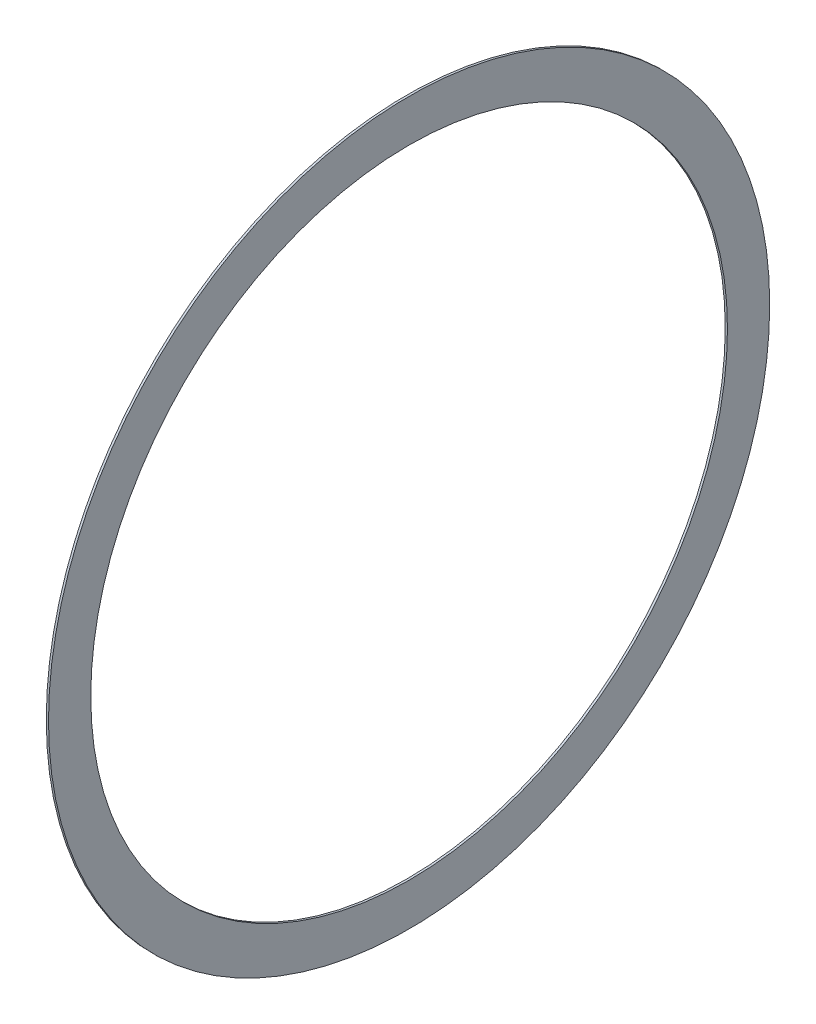
ISO-10303-21;
HEADER;
FILE_DESCRIPTION(('STEP AP214'),'2;1');
FILE_NAME('part.step','',(''),(''),'','','');
FILE_SCHEMA(('AUTOMOTIVE_DESIGN { 1 0 10303 214 1 1 1 1 }'));
ENDSEC;
DATA;
#1=APPLICATION_CONTEXT('core data for automotive mechanical design processes');
#2=APPLICATION_PROTOCOL_DEFINITION('international standard','automotive_design',2000,#1);
#3=PRODUCT_CONTEXT('',#1,'mechanical');
#4=PRODUCT('Part','Part','',(#3));
#5=PRODUCT_RELATED_PRODUCT_CATEGORY('part','',(#4));
#6=PRODUCT_DEFINITION_FORMATION('','',#4);
#7=PRODUCT_DEFINITION_CONTEXT('part definition',#1,'design');
#8=PRODUCT_DEFINITION('design','',#6,#7);
#9=PRODUCT_DEFINITION_SHAPE('','',#8);
#10=(LENGTH_UNIT() NAMED_UNIT(*) SI_UNIT(.MILLI.,.METRE.));
#11=(NAMED_UNIT(*) PLANE_ANGLE_UNIT() SI_UNIT($,.RADIAN.));
#12=(NAMED_UNIT(*) SI_UNIT($,.STERADIAN.) SOLID_ANGLE_UNIT());
#13=UNCERTAINTY_MEASURE_WITH_UNIT(LENGTH_MEASURE(1.E-05),#10,'distance_accuracy_value','');
#14=(GEOMETRIC_REPRESENTATION_CONTEXT(3) GLOBAL_UNCERTAINTY_ASSIGNED_CONTEXT((#13)) GLOBAL_UNIT_ASSIGNED_CONTEXT((#10,
#11,#12)) REPRESENTATION_CONTEXT('',''));
#15=CARTESIAN_POINT('',(0.,0.,0.));
#16=DIRECTION('',(0.,0.,1.));
#17=DIRECTION('',(1.,0.,0.));
#18=AXIS2_PLACEMENT_3D('',#15,#16,#17);
#19=CARTESIAN_POINT('',(0.15,21.65,0.));
#20=DIRECTION('',(1.,0.,0.));
#21=DIRECTION('',(0.,1.,0.));
#22=AXIS2_PLACEMENT_3D('',#19,#20,#21);
#23=PLANE('',#22);
#24=CARTESIAN_POINT('',(0.15,0.,0.));
#25=DIRECTION('',(1.,0.,0.));
#26=DIRECTION('',(0.,0.,-1.));
#27=AXIS2_PLACEMENT_3D('',#24,#25,#26);
#28=CIRCLE('',#27,21.65);
#29=CARTESIAN_POINT('',(0.15,0.,-21.65));
#30=VERTEX_POINT('',#29);
#31=EDGE_CURVE('E10',#30,#30,#28,.T.);
#32=ORIENTED_EDGE('',*,*,#31,.F.);
#33=EDGE_LOOP('',(#32));
#34=FACE_BOUND('',#33,.T.);
#35=CARTESIAN_POINT('',(0.15,0.,0.));
#36=DIRECTION('',(1.,0.,0.));
#37=DIRECTION('',(0.,0.,-1.));
#38=AXIS2_PLACEMENT_3D('',#35,#36,#37);
#39=CIRCLE('',#38,24.525);
#40=CARTESIAN_POINT('',(0.15,0.,-24.525));
#41=VERTEX_POINT('',#40);
#42=EDGE_CURVE('E31',#41,#41,#39,.T.);
#43=ORIENTED_EDGE('',*,*,#42,.T.);
#44=EDGE_LOOP('',(#43));
#45=FACE_BOUND('',#44,.T.);
#46=ADVANCED_FACE('F15',(#34,#45),#23,.T.);
#47=CARTESIAN_POINT('',(0.15,0.,0.));
#48=DIRECTION('',(1.,0.,0.));
#49=DIRECTION('',(0.,0.,-1.));
#50=AXIS2_PLACEMENT_3D('',#47,#48,#49);
#51=CYLINDRICAL_SURFACE('',#50,21.65);
#52=CARTESIAN_POINT('',(0.,0.,0.));
#53=DIRECTION('',(1.,0.,0.));
#54=DIRECTION('',(0.,0.,-1.));
#55=AXIS2_PLACEMENT_3D('',#52,#53,#54);
#56=CIRCLE('',#55,21.65);
#57=CARTESIAN_POINT('',(0.,0.,-21.65));
#58=VERTEX_POINT('',#57);
#59=EDGE_CURVE('E22',#58,#58,#56,.T.);
#60=ORIENTED_EDGE('',*,*,#59,.F.);
#61=EDGE_LOOP('',(#60));
#62=FACE_BOUND('',#61,.T.);
#63=ORIENTED_EDGE('',*,*,#31,.T.);
#64=EDGE_LOOP('',(#63));
#65=FACE_BOUND('',#64,.T.);
#66=ADVANCED_FACE('F48',(#62,#65),#51,.F.);
#67=CARTESIAN_POINT('',(0.,24.525,0.));
#68=DIRECTION('',(-1.,0.,0.));
#69=DIRECTION('',(0.,0.,1.));
#70=AXIS2_PLACEMENT_3D('',#67,#68,#69);
#71=PLANE('',#70);
#72=CARTESIAN_POINT('',(0.,0.,0.));
#73=DIRECTION('',(1.,0.,0.));
#74=DIRECTION('',(0.,0.,-1.));
#75=AXIS2_PLACEMENT_3D('',#72,#73,#74);
#76=CIRCLE('',#75,24.525);
#77=CARTESIAN_POINT('',(0.,0.,-24.525));
#78=VERTEX_POINT('',#77);
#79=EDGE_CURVE('E38',#78,#78,#76,.T.);
#80=ORIENTED_EDGE('',*,*,#79,.F.);
#81=EDGE_LOOP('',(#80));
#82=FACE_BOUND('',#81,.T.);
#83=ORIENTED_EDGE('',*,*,#59,.T.);
#84=EDGE_LOOP('',(#83));
#85=FACE_BOUND('',#84,.T.);
#86=ADVANCED_FACE('F46',(#82,#85),#71,.T.);
#87=CARTESIAN_POINT('',(0.15,0.,0.));
#88=DIRECTION('',(1.,0.,0.));
#89=DIRECTION('',(0.,0.,-1.));
#90=AXIS2_PLACEMENT_3D('',#87,#88,#89);
#91=CYLINDRICAL_SURFACE('',#90,24.525);
#92=ORIENTED_EDGE('',*,*,#42,.F.);
#93=EDGE_LOOP('',(#92));
#94=FACE_BOUND('',#93,.T.);
#95=ORIENTED_EDGE('',*,*,#79,.T.);
#96=EDGE_LOOP('',(#95));
#97=FACE_BOUND('',#96,.T.);
#98=ADVANCED_FACE('F44',(#94,#97),#91,.T.);
#99=CLOSED_SHELL('',(#46,#66,#86,#98));
#100=MANIFOLD_SOLID_BREP('B1',#99);
#101=ADVANCED_BREP_SHAPE_REPRESENTATION('',(#18,#100),#14);
#102=SHAPE_DEFINITION_REPRESENTATION(#9,#101);
ENDSEC;
END-ISO-10303-21;
